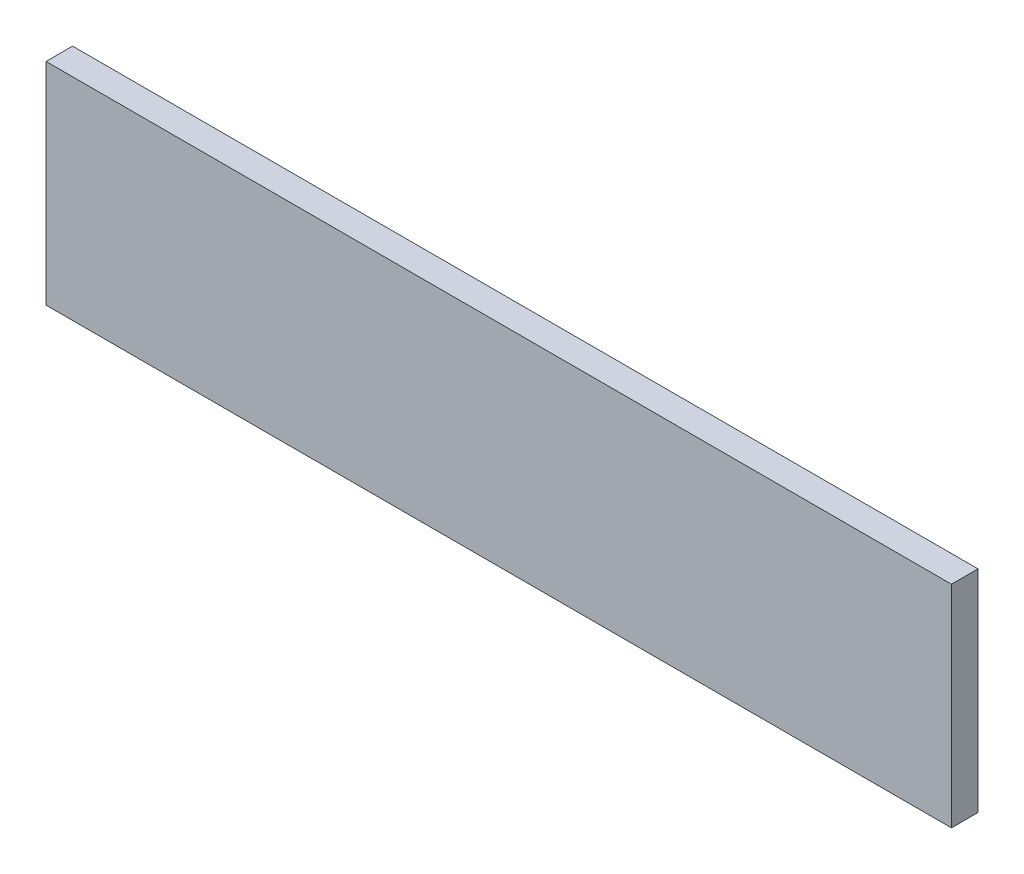
ISO-10303-21;
HEADER;
FILE_DESCRIPTION(('STEP AP214'),'2;1');
FILE_NAME('part.step','',(''),(''),'','','');
FILE_SCHEMA(('AUTOMOTIVE_DESIGN { 1 0 10303 214 1 1 1 1 }'));
ENDSEC;
DATA;
#1=APPLICATION_CONTEXT('core data for automotive mechanical design processes');
#2=APPLICATION_PROTOCOL_DEFINITION('international standard','automotive_design',2000,#1);
#3=PRODUCT_CONTEXT('',#1,'mechanical');
#4=PRODUCT('Part','Part','',(#3));
#5=PRODUCT_RELATED_PRODUCT_CATEGORY('part','',(#4));
#6=PRODUCT_DEFINITION_FORMATION('','',#4);
#7=PRODUCT_DEFINITION_CONTEXT('part definition',#1,'design');
#8=PRODUCT_DEFINITION('design','',#6,#7);
#9=PRODUCT_DEFINITION_SHAPE('','',#8);
#10=(LENGTH_UNIT() NAMED_UNIT(*) SI_UNIT(.MILLI.,.METRE.));
#11=(NAMED_UNIT(*) PLANE_ANGLE_UNIT() SI_UNIT($,.RADIAN.));
#12=(NAMED_UNIT(*) SI_UNIT($,.STERADIAN.) SOLID_ANGLE_UNIT());
#13=UNCERTAINTY_MEASURE_WITH_UNIT(LENGTH_MEASURE(1.E-05),#10,'distance_accuracy_value','');
#14=(GEOMETRIC_REPRESENTATION_CONTEXT(3) GLOBAL_UNCERTAINTY_ASSIGNED_CONTEXT((#13)) GLOBAL_UNIT_ASSIGNED_CONTEXT((#10,
#11,#12)) REPRESENTATION_CONTEXT('',''));
#15=CARTESIAN_POINT('',(0.,0.,0.));
#16=DIRECTION('',(0.,0.,1.));
#17=DIRECTION('',(1.,0.,0.));
#18=AXIS2_PLACEMENT_3D('',#15,#16,#17);
#19=CARTESIAN_POINT('',(133.,15.5,-1.95));
#20=DIRECTION('',(0.,0.,1.));
#21=DIRECTION('',(0.,-1.,0.));
#22=AXIS2_PLACEMENT_3D('',#19,#20,#21);
#23=PLANE('',#22);
#24=DIRECTION('',(0.,1.,0.));
#25=VECTOR('',#24,1.);
#26=CARTESIAN_POINT('',(0.,15.5,-1.95));
#27=LINE('',#26,#25);
#28=CARTESIAN_POINT('',(0.,-15.5,-1.95));
#29=VERTEX_POINT('',#28);
#30=CARTESIAN_POINT('',(0.,15.5,-1.95));
#31=VERTEX_POINT('',#30);
#32=EDGE_CURVE('E96',#29,#31,#27,.T.);
#33=ORIENTED_EDGE('',*,*,#32,.T.);
#34=DIRECTION('',(-1.,0.,0.));
#35=VECTOR('',#34,1.);
#36=CARTESIAN_POINT('',(133.,15.5,-1.95));
#37=LINE('',#36,#35);
#38=CARTESIAN_POINT('',(133.,15.5,-1.95));
#39=VERTEX_POINT('',#38);
#40=EDGE_CURVE('E11',#39,#31,#37,.T.);
#41=ORIENTED_EDGE('',*,*,#40,.F.);
#42=DIRECTION('',(0.,1.,0.));
#43=VECTOR('',#42,1.);
#44=CARTESIAN_POINT('',(133.,15.5,-1.95));
#45=LINE('',#44,#43);
#46=CARTESIAN_POINT('',(133.,-15.5,-1.95));
#47=VERTEX_POINT('',#46);
#48=EDGE_CURVE('E84',#47,#39,#45,.T.);
#49=ORIENTED_EDGE('',*,*,#48,.F.);
#50=DIRECTION('',(-1.,0.,0.));
#51=VECTOR('',#50,1.);
#52=CARTESIAN_POINT('',(133.,-15.5,-1.95));
#53=LINE('',#52,#51);
#54=EDGE_CURVE('E92',#47,#29,#53,.T.);
#55=ORIENTED_EDGE('',*,*,#54,.T.);
#56=EDGE_LOOP('',(#33,#41,#49,#55));
#57=FACE_BOUND('',#56,.T.);
#58=ADVANCED_FACE('F33',(#57),#23,.F.);
#59=CARTESIAN_POINT('',(133.,15.5,1.95));
#60=DIRECTION('',(0.,-1.,0.));
#61=DIRECTION('',(0.,0.,-1.));
#62=AXIS2_PLACEMENT_3D('',#59,#60,#61);
#63=PLANE('',#62);
#64=DIRECTION('',(0.,0.,1.));
#65=VECTOR('',#64,1.);
#66=CARTESIAN_POINT('',(0.,15.5,1.95));
#67=LINE('',#66,#65);
#68=CARTESIAN_POINT('',(0.,15.5,1.95));
#69=VERTEX_POINT('',#68);
#70=EDGE_CURVE('E88',#31,#69,#67,.T.);
#71=ORIENTED_EDGE('',*,*,#70,.T.);
#72=DIRECTION('',(-1.,0.,0.));
#73=VECTOR('',#72,1.);
#74=CARTESIAN_POINT('',(133.,15.5,1.95));
#75=LINE('',#74,#73);
#76=CARTESIAN_POINT('',(133.,15.5,1.95));
#77=VERTEX_POINT('',#76);
#78=EDGE_CURVE('E41',#77,#69,#75,.T.);
#79=ORIENTED_EDGE('',*,*,#78,.F.);
#80=DIRECTION('',(0.,0.,1.));
#81=VECTOR('',#80,1.);
#82=CARTESIAN_POINT('',(133.,15.5,1.95));
#83=LINE('',#82,#81);
#84=EDGE_CURVE('E79',#39,#77,#83,.T.);
#85=ORIENTED_EDGE('',*,*,#84,.F.);
#86=ORIENTED_EDGE('',*,*,#40,.T.);
#87=EDGE_LOOP('',(#71,#79,#85,#86));
#88=FACE_BOUND('',#87,.T.);
#89=ADVANCED_FACE('F87',(#88),#63,.F.);
#90=CARTESIAN_POINT('',(133.,15.5,1.95));
#91=DIRECTION('',(0.,0.,-1.));
#92=DIRECTION('',(0.,1.,0.));
#93=AXIS2_PLACEMENT_3D('',#90,#91,#92);
#94=PLANE('',#93);
#95=DIRECTION('',(0.,-1.,0.));
#96=VECTOR('',#95,1.);
#97=CARTESIAN_POINT('',(0.,15.5,1.95));
#98=LINE('',#97,#96);
#99=CARTESIAN_POINT('',(0.,-15.5,1.95));
#100=VERTEX_POINT('',#99);
#101=EDGE_CURVE('E66',#69,#100,#98,.T.);
#102=ORIENTED_EDGE('',*,*,#101,.T.);
#103=DIRECTION('',(-1.,0.,0.));
#104=VECTOR('',#103,1.);
#105=CARTESIAN_POINT('',(133.,-15.5,1.95));
#106=LINE('',#105,#104);
#107=CARTESIAN_POINT('',(133.,-15.5,1.95));
#108=VERTEX_POINT('',#107);
#109=EDGE_CURVE('E89',#108,#100,#106,.T.);
#110=ORIENTED_EDGE('',*,*,#109,.F.);
#111=DIRECTION('',(0.,-1.,0.));
#112=VECTOR('',#111,1.);
#113=CARTESIAN_POINT('',(133.,15.5,1.95));
#114=LINE('',#113,#112);
#115=EDGE_CURVE('E82',#77,#108,#114,.T.);
#116=ORIENTED_EDGE('',*,*,#115,.F.);
#117=ORIENTED_EDGE('',*,*,#78,.T.);
#118=EDGE_LOOP('',(#102,#110,#116,#117));
#119=FACE_BOUND('',#118,.T.);
#120=ADVANCED_FACE('F90',(#119),#94,.F.);
#121=CARTESIAN_POINT('',(133.,-15.5,1.95));
#122=DIRECTION('',(0.,1.,0.));
#123=DIRECTION('',(0.,0.,1.));
#124=AXIS2_PLACEMENT_3D('',#121,#122,#123);
#125=PLANE('',#124);
#126=DIRECTION('',(0.,0.,-1.));
#127=VECTOR('',#126,1.);
#128=CARTESIAN_POINT('',(0.,-15.5,1.95));
#129=LINE('',#128,#127);
#130=EDGE_CURVE('E72',#100,#29,#129,.T.);
#131=ORIENTED_EDGE('',*,*,#130,.T.);
#132=ORIENTED_EDGE('',*,*,#54,.F.);
#133=DIRECTION('',(0.,0.,-1.));
#134=VECTOR('',#133,1.);
#135=CARTESIAN_POINT('',(133.,-15.5,1.95));
#136=LINE('',#135,#134);
#137=EDGE_CURVE('E49',#108,#47,#136,.T.);
#138=ORIENTED_EDGE('',*,*,#137,.F.);
#139=ORIENTED_EDGE('',*,*,#109,.T.);
#140=EDGE_LOOP('',(#131,#132,#138,#139));
#141=FACE_BOUND('',#140,.T.);
#142=ADVANCED_FACE('F103',(#141),#125,.F.);
#143=CARTESIAN_POINT('',(133.,0.,0.));
#144=DIRECTION('',(1.,0.,0.));
#145=DIRECTION('',(0.,0.,-1.));
#146=AXIS2_PLACEMENT_3D('',#143,#144,#145);
#147=PLANE('',#146);
#148=ORIENTED_EDGE('',*,*,#48,.T.);
#149=ORIENTED_EDGE('',*,*,#84,.T.);
#150=ORIENTED_EDGE('',*,*,#115,.T.);
#151=ORIENTED_EDGE('',*,*,#137,.T.);
#152=EDGE_LOOP('',(#148,#149,#150,#151));
#153=FACE_BOUND('',#152,.T.);
#154=ADVANCED_FACE('F80',(#153),#147,.T.);
#155=CARTESIAN_POINT('',(0.,0.,0.));
#156=DIRECTION('',(1.,0.,0.));
#157=DIRECTION('',(0.,0.,-1.));
#158=AXIS2_PLACEMENT_3D('',#155,#156,#157);
#159=PLANE('',#158);
#160=ORIENTED_EDGE('',*,*,#32,.F.);
#161=ORIENTED_EDGE('',*,*,#130,.F.);
#162=ORIENTED_EDGE('',*,*,#101,.F.);
#163=ORIENTED_EDGE('',*,*,#70,.F.);
#164=EDGE_LOOP('',(#160,#161,#162,#163));
#165=FACE_BOUND('',#164,.T.);
#166=ADVANCED_FACE('F106',(#165),#159,.F.);
#167=CLOSED_SHELL('',(#58,#89,#120,#142,#154,#166));
#168=MANIFOLD_SOLID_BREP('B2',#167);
#169=ADVANCED_BREP_SHAPE_REPRESENTATION('',(#18,#168),#14);
#170=SHAPE_DEFINITION_REPRESENTATION(#9,#169);
ENDSEC;
END-ISO-10303-21;
